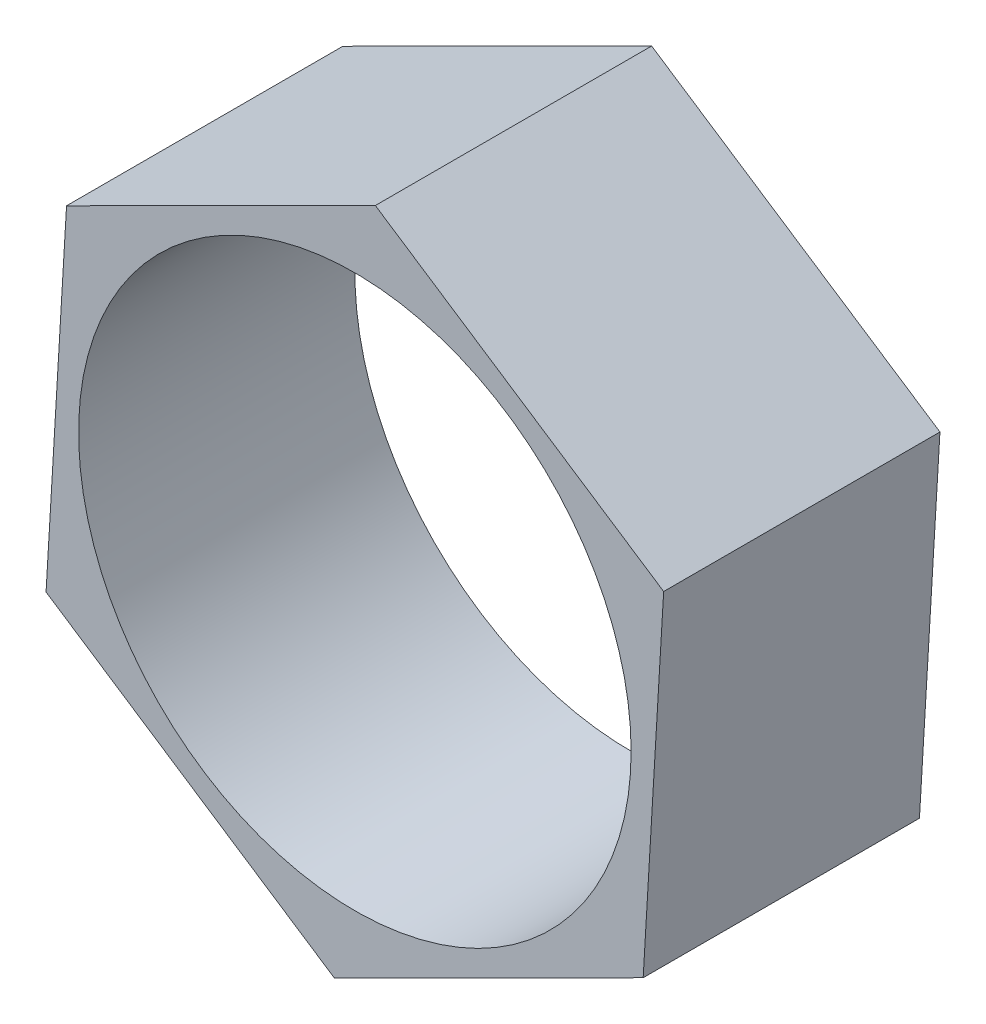
ISO-10303-21;
HEADER;
FILE_DESCRIPTION(('STEP AP214'),'2;1');
FILE_NAME('part.step','',(''),(''),'','','');
FILE_SCHEMA(('AUTOMOTIVE_DESIGN { 1 0 10303 214 1 1 1 1 }'));
ENDSEC;
DATA;
#1=APPLICATION_CONTEXT('core data for automotive mechanical design processes');
#2=APPLICATION_PROTOCOL_DEFINITION('international standard','automotive_design',2000,#1);
#3=PRODUCT_CONTEXT('',#1,'mechanical');
#4=PRODUCT('Part','Part','',(#3));
#5=PRODUCT_RELATED_PRODUCT_CATEGORY('part','',(#4));
#6=PRODUCT_DEFINITION_FORMATION('','',#4);
#7=PRODUCT_DEFINITION_CONTEXT('part definition',#1,'design');
#8=PRODUCT_DEFINITION('design','',#6,#7);
#9=PRODUCT_DEFINITION_SHAPE('','',#8);
#10=(LENGTH_UNIT() NAMED_UNIT(*) SI_UNIT(.MILLI.,.METRE.));
#11=(NAMED_UNIT(*) PLANE_ANGLE_UNIT() SI_UNIT($,.RADIAN.));
#12=(NAMED_UNIT(*) SI_UNIT($,.STERADIAN.) SOLID_ANGLE_UNIT());
#13=UNCERTAINTY_MEASURE_WITH_UNIT(LENGTH_MEASURE(1.E-05),#10,'distance_accuracy_value','');
#14=(GEOMETRIC_REPRESENTATION_CONTEXT(3) GLOBAL_UNCERTAINTY_ASSIGNED_CONTEXT((#13)) GLOBAL_UNIT_ASSIGNED_CONTEXT((#10,
#11,#12)) REPRESENTATION_CONTEXT('',''));
#15=CARTESIAN_POINT('',(0.,0.,0.));
#16=DIRECTION('',(0.,0.,1.));
#17=DIRECTION('',(1.,0.,0.));
#18=AXIS2_PLACEMENT_3D('',#15,#16,#17);
#19=CARTESIAN_POINT('',(0.,0.,1.));
#20=DIRECTION('',(0.,0.,1.));
#21=DIRECTION('',(1.,0.,0.));
#22=AXIS2_PLACEMENT_3D('',#19,#20,#21);
#23=PLANE('',#22);
#24=DIRECTION('',(-0.83483094267061,0.5505064006528,0.));
#25=VECTOR('',#24,1.);
#26=CARTESIAN_POINT('',(1.11770999905821,0.559664504864573,1.));
#27=LINE('',#26,#25);
#28=CARTESIAN_POINT('',(1.11770999905821,0.559664504864573,1.));
#29=VERTEX_POINT('',#28);
#30=CARTESIAN_POINT('',(0.074171320719943,1.24779750568057,1.));
#31=VERTEX_POINT('',#30);
#32=EDGE_CURVE('E131',#29,#31,#27,.T.);
#33=ORIENTED_EDGE('',*,*,#32,.T.);
#34=DIRECTION('',(-0.894167999246564,-0.447731603891658,0.));
#35=VECTOR('',#34,1.);
#36=CARTESIAN_POINT('',(0.074171320719943,1.24779750568057,1.));
#37=LINE('',#36,#35);
#38=CARTESIAN_POINT('',(-1.04353867833826,0.688133000816,1.));
#39=VERTEX_POINT('',#38);
#40=EDGE_CURVE('E89',#31,#39,#37,.T.);
#41=ORIENTED_EDGE('',*,*,#40,.T.);
#42=DIRECTION('',(-0.0593370565759543,-0.998238004544458,0.));
#43=VECTOR('',#42,1.);
#44=CARTESIAN_POINT('',(-1.04353867833826,0.688133000816,1.));
#45=LINE('',#44,#43);
#46=CARTESIAN_POINT('',(-1.1177099990582,-0.559664504864573,1.));
#47=VERTEX_POINT('',#46);
#48=EDGE_CURVE('E102',#39,#47,#45,.T.);
#49=ORIENTED_EDGE('',*,*,#48,.T.);
#50=DIRECTION('',(0.83483094267061,-0.5505064006528,0.));
#51=VECTOR('',#50,1.);
#52=CARTESIAN_POINT('',(-1.1177099990582,-0.559664504864573,1.));
#53=LINE('',#52,#51);
#54=CARTESIAN_POINT('',(-0.0741713207199425,-1.24779750568057,1.));
#55=VERTEX_POINT('',#54);
#56=EDGE_CURVE('E96',#47,#55,#53,.T.);
#57=ORIENTED_EDGE('',*,*,#56,.T.);
#58=DIRECTION('',(0.894167999246564,0.447731603891658,0.));
#59=VECTOR('',#58,1.);
#60=CARTESIAN_POINT('',(-0.0741713207199425,-1.24779750568057,1.));
#61=LINE('',#60,#59);
#62=CARTESIAN_POINT('',(1.04353867833826,-0.688133000816,1.));
#63=VERTEX_POINT('',#62);
#64=EDGE_CURVE('E100',#55,#63,#61,.T.);
#65=ORIENTED_EDGE('',*,*,#64,.T.);
#66=DIRECTION('',(0.0593370565759544,0.998238004544458,0.));
#67=VECTOR('',#66,1.);
#68=CARTESIAN_POINT('',(1.04353867833826,-0.688133000816,1.));
#69=LINE('',#68,#67);
#70=EDGE_CURVE('E52',#63,#29,#69,.T.);
#71=ORIENTED_EDGE('',*,*,#70,.T.);
#72=EDGE_LOOP('',(#33,#41,#49,#57,#65,#71));
#73=FACE_BOUND('',#72,.T.);
#74=CARTESIAN_POINT('',(0.,0.,1.));
#75=DIRECTION('',(0.,0.,1.));
#76=DIRECTION('',(1.,0.,0.));
#77=AXIS2_PLACEMENT_3D('',#74,#75,#76);
#78=CIRCLE('',#77,1.);
#79=CARTESIAN_POINT('',(1.,0.,1.));
#80=VERTEX_POINT('',#79);
#81=EDGE_CURVE('E124',#80,#80,#78,.T.);
#82=ORIENTED_EDGE('',*,*,#81,.F.);
#83=EDGE_LOOP('',(#82));
#84=FACE_BOUND('',#83,.T.);
#85=ADVANCED_FACE('F35',(#73,#84),#23,.T.);
#86=CARTESIAN_POINT('',(0.,0.,0.));
#87=DIRECTION('',(0.,0.,1.));
#88=DIRECTION('',(1.,0.,0.));
#89=AXIS2_PLACEMENT_3D('',#86,#87,#88);
#90=PLANE('',#89);
#91=DIRECTION('',(-0.83483094267061,0.5505064006528,0.));
#92=VECTOR('',#91,1.);
#93=CARTESIAN_POINT('',(1.11770999905821,0.559664504864573,0.));
#94=LINE('',#93,#92);
#95=CARTESIAN_POINT('',(1.11770999905821,0.559664504864573,0.));
#96=VERTEX_POINT('',#95);
#97=CARTESIAN_POINT('',(0.074171320719943,1.24779750568057,0.));
#98=VERTEX_POINT('',#97);
#99=EDGE_CURVE('E120',#96,#98,#94,.T.);
#100=ORIENTED_EDGE('',*,*,#99,.F.);
#101=DIRECTION('',(0.0593370565759544,0.998238004544458,0.));
#102=VECTOR('',#101,1.);
#103=CARTESIAN_POINT('',(1.04353867833826,-0.688133000816,0.));
#104=LINE('',#103,#102);
#105=CARTESIAN_POINT('',(1.04353867833826,-0.688133000816,0.));
#106=VERTEX_POINT('',#105);
#107=EDGE_CURVE('E81',#106,#96,#104,.T.);
#108=ORIENTED_EDGE('',*,*,#107,.F.);
#109=DIRECTION('',(0.894167999246564,0.447731603891658,0.));
#110=VECTOR('',#109,1.);
#111=CARTESIAN_POINT('',(-0.0741713207199425,-1.24779750568057,0.));
#112=LINE('',#111,#110);
#113=CARTESIAN_POINT('',(-0.0741713207199425,-1.24779750568057,0.));
#114=VERTEX_POINT('',#113);
#115=EDGE_CURVE('E75',#114,#106,#112,.T.);
#116=ORIENTED_EDGE('',*,*,#115,.F.);
#117=DIRECTION('',(0.83483094267061,-0.5505064006528,0.));
#118=VECTOR('',#117,1.);
#119=CARTESIAN_POINT('',(-1.1177099990582,-0.559664504864573,0.));
#120=LINE('',#119,#118);
#121=CARTESIAN_POINT('',(-1.1177099990582,-0.559664504864573,0.));
#122=VERTEX_POINT('',#121);
#123=EDGE_CURVE('E110',#122,#114,#120,.T.);
#124=ORIENTED_EDGE('',*,*,#123,.F.);
#125=DIRECTION('',(-0.0593370565759543,-0.998238004544458,0.));
#126=VECTOR('',#125,1.);
#127=CARTESIAN_POINT('',(-1.04353867833826,0.688133000816,0.));
#128=LINE('',#127,#126);
#129=CARTESIAN_POINT('',(-1.04353867833826,0.688133000816,0.));
#130=VERTEX_POINT('',#129);
#131=EDGE_CURVE('E126',#130,#122,#128,.T.);
#132=ORIENTED_EDGE('',*,*,#131,.F.);
#133=DIRECTION('',(-0.894167999246564,-0.447731603891658,0.));
#134=VECTOR('',#133,1.);
#135=CARTESIAN_POINT('',(0.074171320719943,1.24779750568057,0.));
#136=LINE('',#135,#134);
#137=EDGE_CURVE('E123',#98,#130,#136,.T.);
#138=ORIENTED_EDGE('',*,*,#137,.F.);
#139=EDGE_LOOP('',(#100,#108,#116,#124,#132,#138));
#140=FACE_BOUND('',#139,.T.);
#141=CARTESIAN_POINT('',(0.,0.,0.));
#142=DIRECTION('',(0.,0.,1.));
#143=DIRECTION('',(1.,0.,0.));
#144=AXIS2_PLACEMENT_3D('',#141,#142,#143);
#145=CIRCLE('',#144,1.);
#146=CARTESIAN_POINT('',(1.,0.,0.));
#147=VERTEX_POINT('',#146);
#148=EDGE_CURVE('E224',#147,#147,#145,.T.);
#149=ORIENTED_EDGE('',*,*,#148,.T.);
#150=EDGE_LOOP('',(#149));
#151=FACE_BOUND('',#150,.T.);
#152=ADVANCED_FACE('F140',(#140,#151),#90,.F.);
#153=CARTESIAN_POINT('',(1.11770999905821,0.559664504864573,1.));
#154=DIRECTION('',(-0.5505064006528,-0.83483094267061,0.));
#155=DIRECTION('',(0.83483094267061,-0.5505064006528,0.));
#156=AXIS2_PLACEMENT_3D('',#153,#154,#155);
#157=PLANE('',#156);
#158=ORIENTED_EDGE('',*,*,#99,.T.);
#159=DIRECTION('',(0.,0.,-1.));
#160=VECTOR('',#159,1.);
#161=CARTESIAN_POINT('',(0.074171320719943,1.24779750568057,1.));
#162=LINE('',#161,#160);
#163=EDGE_CURVE('E11',#31,#98,#162,.T.);
#164=ORIENTED_EDGE('',*,*,#163,.F.);
#165=ORIENTED_EDGE('',*,*,#32,.F.);
#166=DIRECTION('',(0.,0.,-1.));
#167=VECTOR('',#166,1.);
#168=CARTESIAN_POINT('',(1.11770999905821,0.559664504864573,1.));
#169=LINE('',#168,#167);
#170=EDGE_CURVE('E116',#29,#96,#169,.T.);
#171=ORIENTED_EDGE('',*,*,#170,.T.);
#172=EDGE_LOOP('',(#158,#164,#165,#171));
#173=FACE_BOUND('',#172,.T.);
#174=ADVANCED_FACE('F37',(#173),#157,.F.);
#175=CARTESIAN_POINT('',(0.074171320719943,1.24779750568057,1.));
#176=DIRECTION('',(0.447731603891658,-0.894167999246564,0.));
#177=DIRECTION('',(0.894167999246564,0.447731603891658,0.));
#178=AXIS2_PLACEMENT_3D('',#175,#176,#177);
#179=PLANE('',#178);
#180=ORIENTED_EDGE('',*,*,#137,.T.);
#181=DIRECTION('',(0.,0.,-1.));
#182=VECTOR('',#181,1.);
#183=CARTESIAN_POINT('',(-1.04353867833826,0.688133000816,1.));
#184=LINE('',#183,#182);
#185=EDGE_CURVE('E44',#39,#130,#184,.T.);
#186=ORIENTED_EDGE('',*,*,#185,.F.);
#187=ORIENTED_EDGE('',*,*,#40,.F.);
#188=ORIENTED_EDGE('',*,*,#163,.T.);
#189=EDGE_LOOP('',(#180,#186,#187,#188));
#190=FACE_BOUND('',#189,.T.);
#191=ADVANCED_FACE('F165',(#190),#179,.F.);
#192=CARTESIAN_POINT('',(-1.04353867833826,0.688133000816,1.));
#193=DIRECTION('',(0.998238004544458,-0.0593370565759543,0.));
#194=DIRECTION('',(0.0593370565759543,0.998238004544458,0.));
#195=AXIS2_PLACEMENT_3D('',#192,#193,#194);
#196=PLANE('',#195);
#197=ORIENTED_EDGE('',*,*,#131,.T.);
#198=DIRECTION('',(0.,0.,-1.));
#199=VECTOR('',#198,1.);
#200=CARTESIAN_POINT('',(-1.1177099990582,-0.559664504864573,1.));
#201=LINE('',#200,#199);
#202=EDGE_CURVE('E111',#47,#122,#201,.T.);
#203=ORIENTED_EDGE('',*,*,#202,.F.);
#204=ORIENTED_EDGE('',*,*,#48,.F.);
#205=ORIENTED_EDGE('',*,*,#185,.T.);
#206=EDGE_LOOP('',(#197,#203,#204,#205));
#207=FACE_BOUND('',#206,.T.);
#208=ADVANCED_FACE('F137',(#207),#196,.F.);
#209=CARTESIAN_POINT('',(-1.1177099990582,-0.559664504864573,1.));
#210=DIRECTION('',(0.5505064006528,0.83483094267061,0.));
#211=DIRECTION('',(-0.83483094267061,0.5505064006528,0.));
#212=AXIS2_PLACEMENT_3D('',#209,#210,#211);
#213=PLANE('',#212);
#214=ORIENTED_EDGE('',*,*,#123,.T.);
#215=DIRECTION('',(0.,0.,-1.));
#216=VECTOR('',#215,1.);
#217=CARTESIAN_POINT('',(-0.0741713207199425,-1.24779750568057,1.));
#218=LINE('',#217,#216);
#219=EDGE_CURVE('E107',#55,#114,#218,.T.);
#220=ORIENTED_EDGE('',*,*,#219,.F.);
#221=ORIENTED_EDGE('',*,*,#56,.F.);
#222=ORIENTED_EDGE('',*,*,#202,.T.);
#223=EDGE_LOOP('',(#214,#220,#221,#222));
#224=FACE_BOUND('',#223,.T.);
#225=ADVANCED_FACE('F108',(#224),#213,.F.);
#226=CARTESIAN_POINT('',(-0.0741713207199425,-1.24779750568057,1.));
#227=DIRECTION('',(-0.447731603891658,0.894167999246564,0.));
#228=DIRECTION('',(-0.894167999246564,-0.447731603891658,0.));
#229=AXIS2_PLACEMENT_3D('',#226,#227,#228);
#230=PLANE('',#229);
#231=ORIENTED_EDGE('',*,*,#115,.T.);
#232=DIRECTION('',(0.,0.,-1.));
#233=VECTOR('',#232,1.);
#234=CARTESIAN_POINT('',(1.04353867833826,-0.688133000816,1.));
#235=LINE('',#234,#233);
#236=EDGE_CURVE('E112',#63,#106,#235,.T.);
#237=ORIENTED_EDGE('',*,*,#236,.F.);
#238=ORIENTED_EDGE('',*,*,#64,.F.);
#239=ORIENTED_EDGE('',*,*,#219,.T.);
#240=EDGE_LOOP('',(#231,#237,#238,#239));
#241=FACE_BOUND('',#240,.T.);
#242=ADVANCED_FACE('F114',(#241),#230,.F.);
#243=CARTESIAN_POINT('',(1.04353867833826,-0.688133000816,1.));
#244=DIRECTION('',(-0.998238004544458,0.0593370565759544,0.));
#245=DIRECTION('',(-0.0593370565759544,-0.998238004544458,0.));
#246=AXIS2_PLACEMENT_3D('',#243,#244,#245);
#247=PLANE('',#246);
#248=ORIENTED_EDGE('',*,*,#107,.T.);
#249=ORIENTED_EDGE('',*,*,#170,.F.);
#250=ORIENTED_EDGE('',*,*,#70,.F.);
#251=ORIENTED_EDGE('',*,*,#236,.T.);
#252=EDGE_LOOP('',(#248,#249,#250,#251));
#253=FACE_BOUND('',#252,.T.);
#254=ADVANCED_FACE('F145',(#253),#247,.F.);
#255=CARTESIAN_POINT('',(0.,0.,1.));
#256=DIRECTION('',(0.,0.,-1.));
#257=DIRECTION('',(-1.,0.,0.));
#258=AXIS2_PLACEMENT_3D('',#255,#256,#257);
#259=CYLINDRICAL_SURFACE('',#258,1.);
#260=ORIENTED_EDGE('',*,*,#81,.T.);
#261=EDGE_LOOP('',(#260));
#262=FACE_BOUND('',#261,.T.);
#263=ORIENTED_EDGE('',*,*,#148,.F.);
#264=EDGE_LOOP('',(#263));
#265=FACE_BOUND('',#264,.T.);
#266=ADVANCED_FACE('F147',(#262,#265),#259,.F.);
#267=CLOSED_SHELL('',(#85,#152,#174,#191,#208,#225,#242,#254,#266));
#268=MANIFOLD_SOLID_BREP('B2',#267);
#269=ADVANCED_BREP_SHAPE_REPRESENTATION('',(#18,#268),#14);
#270=SHAPE_DEFINITION_REPRESENTATION(#9,#269);
ENDSEC;
END-ISO-10303-21;
